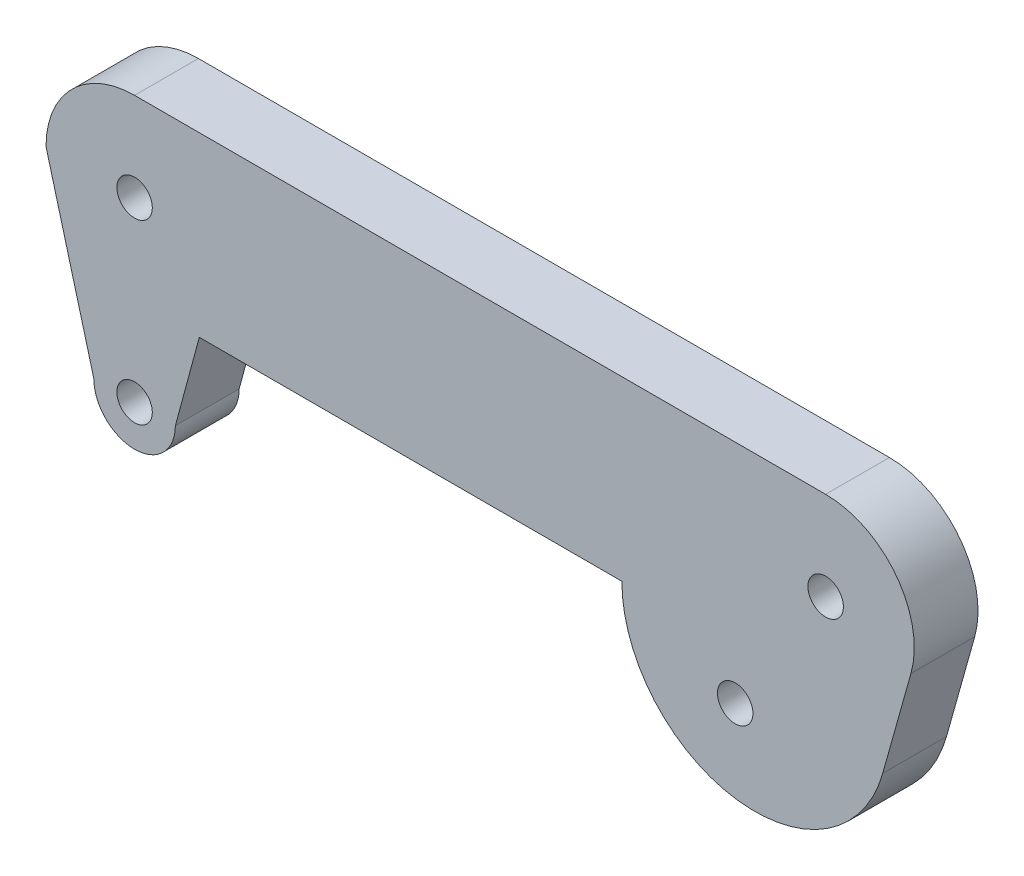
ISO-10303-21;
HEADER;
FILE_DESCRIPTION(('STEP AP214'),'2;1');
FILE_NAME('part.step','',(''),(''),'','','');
FILE_SCHEMA(('AUTOMOTIVE_DESIGN { 1 0 10303 214 1 1 1 1 }'));
ENDSEC;
DATA;
#1=APPLICATION_CONTEXT('core data for automotive mechanical design processes');
#2=APPLICATION_PROTOCOL_DEFINITION('international standard','automotive_design',2000,#1);
#3=PRODUCT_CONTEXT('',#1,'mechanical');
#4=PRODUCT('Part','Part','',(#3));
#5=PRODUCT_RELATED_PRODUCT_CATEGORY('part','',(#4));
#6=PRODUCT_DEFINITION_FORMATION('','',#4);
#7=PRODUCT_DEFINITION_CONTEXT('part definition',#1,'design');
#8=PRODUCT_DEFINITION('design','',#6,#7);
#9=PRODUCT_DEFINITION_SHAPE('','',#8);
#10=(LENGTH_UNIT() NAMED_UNIT(*) SI_UNIT(.MILLI.,.METRE.));
#11=(NAMED_UNIT(*) PLANE_ANGLE_UNIT() SI_UNIT($,.RADIAN.));
#12=(NAMED_UNIT(*) SI_UNIT($,.STERADIAN.) SOLID_ANGLE_UNIT());
#13=UNCERTAINTY_MEASURE_WITH_UNIT(LENGTH_MEASURE(1.E-05),#10,'distance_accuracy_value','');
#14=(GEOMETRIC_REPRESENTATION_CONTEXT(3) GLOBAL_UNCERTAINTY_ASSIGNED_CONTEXT((#13)) GLOBAL_UNIT_ASSIGNED_CONTEXT((#10,
#11,#12)) REPRESENTATION_CONTEXT('',''));
#15=CARTESIAN_POINT('',(0.,0.,0.));
#16=DIRECTION('',(0.,0.,1.));
#17=DIRECTION('',(1.,0.,0.));
#18=AXIS2_PLACEMENT_3D('',#15,#16,#17);
#19=CARTESIAN_POINT('',(0.,0.,3.6));
#20=DIRECTION('',(0.,0.,1.));
#21=DIRECTION('',(1.,0.,0.));
#22=AXIS2_PLACEMENT_3D('',#19,#20,#21);
#23=PLANE('',#22);
#24=CARTESIAN_POINT('',(39.,0.,3.6));
#25=DIRECTION('',(0.,0.,1.));
#26=DIRECTION('',(1.,0.,0.));
#27=AXIS2_PLACEMENT_3D('',#24,#25,#26);
#28=CIRCLE('',#27,0.999999999999998);
#29=CARTESIAN_POINT('',(40.,0.,3.6));
#30=VERTEX_POINT('',#29);
#31=EDGE_CURVE('E203',#30,#30,#28,.T.);
#32=ORIENTED_EDGE('',*,*,#31,.F.);
#33=EDGE_LOOP('',(#32));
#34=FACE_BOUND('',#33,.T.);
#35=CARTESIAN_POINT('',(0.,-10.,3.6));
#36=DIRECTION('',(0.,0.,1.));
#37=DIRECTION('',(1.,0.,0.));
#38=AXIS2_PLACEMENT_3D('',#35,#36,#37);
#39=CIRCLE('',#38,1.);
#40=CARTESIAN_POINT('',(1.00000000000005,-10.,3.6));
#41=VERTEX_POINT('',#40);
#42=EDGE_CURVE('E139',#41,#41,#39,.T.);
#43=ORIENTED_EDGE('',*,*,#42,.F.);
#44=EDGE_LOOP('',(#43));
#45=FACE_BOUND('',#44,.T.);
#46=CARTESIAN_POINT('',(0.,0.,3.6));
#47=DIRECTION('',(0.,0.,1.));
#48=DIRECTION('',(1.,0.,0.));
#49=AXIS2_PLACEMENT_3D('',#46,#47,#48);
#50=CIRCLE('',#49,5.);
#51=CARTESIAN_POINT('',(0.,5.,3.6));
#52=VERTEX_POINT('',#51);
#53=CARTESIAN_POINT('',(-4.99999990617374,-0.000968639534541923,3.6));
#54=VERTEX_POINT('',#53);
#55=EDGE_CURVE('E152',#52,#54,#50,.T.);
#56=ORIENTED_EDGE('',*,*,#55,.T.);
#57=DIRECTION('',(0.26068937942533,-0.965422729924481,0.));
#58=VECTOR('',#57,1.);
#59=CARTESIAN_POINT('',(-4.99999990617374,-0.000968639534541923,3.6));
#60=LINE('',#59,#58);
#61=CARTESIAN_POINT('',(-2.29999999999995,-10.,3.6));
#62=VERTEX_POINT('',#61);
#63=EDGE_CURVE('E95',#54,#62,#60,.T.);
#64=ORIENTED_EDGE('',*,*,#63,.T.);
#65=CARTESIAN_POINT('',(0.,-10.,3.6));
#66=DIRECTION('',(0.,0.,1.));
#67=DIRECTION('',(1.,0.,0.));
#68=AXIS2_PLACEMENT_3D('',#65,#66,#67);
#69=CIRCLE('',#68,2.3);
#70=CARTESIAN_POINT('',(2.30000000000005,-10.,3.6));
#71=VERTEX_POINT('',#70);
#72=EDGE_CURVE('E170',#62,#71,#69,.T.);
#73=ORIENTED_EDGE('',*,*,#72,.T.);
#74=DIRECTION('',(0.260979971046942,0.965344215662132,0.));
#75=VECTOR('',#74,1.);
#76=CARTESIAN_POINT('',(2.30000000000005,-10.,3.6));
#77=LINE('',#76,#75);
#78=CARTESIAN_POINT('',(3.65174566135431,-5.,3.6));
#79=VERTEX_POINT('',#78);
#80=EDGE_CURVE('E187',#71,#79,#77,.T.);
#81=ORIENTED_EDGE('',*,*,#80,.T.);
#82=DIRECTION('',(1.,0.,0.));
#83=VECTOR('',#82,1.);
#84=CARTESIAN_POINT('',(3.65174566135431,-5.,3.6));
#85=LINE('',#84,#83);
#86=CARTESIAN_POINT('',(27.5,-5.,3.6));
#87=VERTEX_POINT('',#86);
#88=EDGE_CURVE('E186',#79,#87,#85,.T.);
#89=ORIENTED_EDGE('',*,*,#88,.T.);
#90=CARTESIAN_POINT('',(35.,-5.,3.6));
#91=DIRECTION('',(0.,0.,1.));
#92=DIRECTION('',(-1.,0.,0.));
#93=AXIS2_PLACEMENT_3D('',#90,#91,#92);
#94=CIRCLE('',#93,7.5);
#95=CARTESIAN_POINT('',(42.2209570682401,-7.02676565459204,3.6));
#96=VERTEX_POINT('',#95);
#97=EDGE_CURVE('E117',#87,#96,#94,.T.);
#98=ORIENTED_EDGE('',*,*,#97,.T.);
#99=DIRECTION('',(0.270235420612273,0.962794275765341,0.));
#100=VECTOR('',#99,1.);
#101=CARTESIAN_POINT('',(43.8139713788267,-1.35117710306136,3.6));
#102=LINE('',#101,#100);
#103=CARTESIAN_POINT('',(43.8139713788267,-1.35117710306136,3.6));
#104=VERTEX_POINT('',#103);
#105=EDGE_CURVE('E111',#96,#104,#102,.T.);
#106=ORIENTED_EDGE('',*,*,#105,.T.);
#107=CARTESIAN_POINT('',(39.,0.,3.6));
#108=DIRECTION('',(0.,0.,1.));
#109=DIRECTION('',(1.,0.,0.));
#110=AXIS2_PLACEMENT_3D('',#107,#108,#109);
#111=CIRCLE('',#110,5.);
#112=CARTESIAN_POINT('',(39.,5.,3.6));
#113=VERTEX_POINT('',#112);
#114=EDGE_CURVE('E115',#104,#113,#111,.T.);
#115=ORIENTED_EDGE('',*,*,#114,.T.);
#116=DIRECTION('',(-1.,0.,0.));
#117=VECTOR('',#116,1.);
#118=CARTESIAN_POINT('',(0.,5.,3.6));
#119=LINE('',#118,#117);
#120=EDGE_CURVE('E49',#113,#52,#119,.T.);
#121=ORIENTED_EDGE('',*,*,#120,.T.);
#122=EDGE_LOOP('',(#56,#64,#73,#81,#89,#98,#106,#115,#121));
#123=FACE_BOUND('',#122,.T.);
#124=CARTESIAN_POINT('',(0.,0.,3.6));
#125=DIRECTION('',(0.,0.,1.));
#126=DIRECTION('',(1.,0.,0.));
#127=AXIS2_PLACEMENT_3D('',#124,#125,#126);
#128=CIRCLE('',#127,1.);
#129=CARTESIAN_POINT('',(1.,0.,3.6));
#130=VERTEX_POINT('',#129);
#131=EDGE_CURVE('E197',#130,#130,#128,.T.);
#132=ORIENTED_EDGE('',*,*,#131,.F.);
#133=EDGE_LOOP('',(#132));
#134=FACE_BOUND('',#133,.T.);
#135=CARTESIAN_POINT('',(33.8952959001801,-7.76697686679029,3.6));
#136=DIRECTION('',(0.,0.,1.));
#137=DIRECTION('',(1.,0.,0.));
#138=AXIS2_PLACEMENT_3D('',#135,#136,#137);
#139=CIRCLE('',#138,0.999999999999998);
#140=CARTESIAN_POINT('',(34.8952959001801,-7.76697686679029,3.6));
#141=VERTEX_POINT('',#140);
#142=EDGE_CURVE('E209',#141,#141,#139,.T.);
#143=ORIENTED_EDGE('',*,*,#142,.F.);
#144=EDGE_LOOP('',(#143));
#145=FACE_BOUND('',#144,.T.);
#146=ADVANCED_FACE('F32',(#34,#45,#123,#134,#145),#23,.T.);
#147=CARTESIAN_POINT('',(0.,0.,0.));
#148=DIRECTION('',(0.,0.,1.));
#149=DIRECTION('',(1.,0.,0.));
#150=AXIS2_PLACEMENT_3D('',#147,#148,#149);
#151=PLANE('',#150);
#152=CARTESIAN_POINT('',(0.,0.,0.));
#153=DIRECTION('',(0.,0.,1.));
#154=DIRECTION('',(1.,0.,0.));
#155=AXIS2_PLACEMENT_3D('',#152,#153,#154);
#156=CIRCLE('',#155,5.);
#157=CARTESIAN_POINT('',(0.,5.,0.));
#158=VERTEX_POINT('',#157);
#159=CARTESIAN_POINT('',(-4.99999990617374,-0.000968639534541923,0.));
#160=VERTEX_POINT('',#159);
#161=EDGE_CURVE('E135',#158,#160,#156,.T.);
#162=ORIENTED_EDGE('',*,*,#161,.F.);
#163=DIRECTION('',(-1.,0.,0.));
#164=VECTOR('',#163,1.);
#165=CARTESIAN_POINT('',(0.,5.,0.));
#166=LINE('',#165,#164);
#167=CARTESIAN_POINT('',(39.,5.,0.));
#168=VERTEX_POINT('',#167);
#169=EDGE_CURVE('E87',#168,#158,#166,.T.);
#170=ORIENTED_EDGE('',*,*,#169,.F.);
#171=CARTESIAN_POINT('',(39.,0.,0.));
#172=DIRECTION('',(0.,0.,1.));
#173=DIRECTION('',(1.,0.,0.));
#174=AXIS2_PLACEMENT_3D('',#171,#172,#173);
#175=CIRCLE('',#174,5.);
#176=CARTESIAN_POINT('',(43.8139713788267,-1.35117710306136,0.));
#177=VERTEX_POINT('',#176);
#178=EDGE_CURVE('E81',#177,#168,#175,.T.);
#179=ORIENTED_EDGE('',*,*,#178,.F.);
#180=DIRECTION('',(0.270235420612273,0.962794275765341,0.));
#181=VECTOR('',#180,1.);
#182=CARTESIAN_POINT('',(43.8139713788267,-1.35117710306136,0.));
#183=LINE('',#182,#181);
#184=CARTESIAN_POINT('',(42.2209570682401,-7.02676565459204,0.));
#185=VERTEX_POINT('',#184);
#186=EDGE_CURVE('E125',#185,#177,#183,.T.);
#187=ORIENTED_EDGE('',*,*,#186,.F.);
#188=CARTESIAN_POINT('',(35.,-5.,0.));
#189=DIRECTION('',(0.,0.,1.));
#190=DIRECTION('',(-1.,0.,0.));
#191=AXIS2_PLACEMENT_3D('',#188,#189,#190);
#192=CIRCLE('',#191,7.5);
#193=CARTESIAN_POINT('',(27.5,-5.,0.));
#194=VERTEX_POINT('',#193);
#195=EDGE_CURVE('E147',#194,#185,#192,.T.);
#196=ORIENTED_EDGE('',*,*,#195,.F.);
#197=DIRECTION('',(1.,0.,0.));
#198=VECTOR('',#197,1.);
#199=CARTESIAN_POINT('',(3.65174566135431,-5.,0.));
#200=LINE('',#199,#198);
#201=CARTESIAN_POINT('',(3.65174566135431,-5.,0.));
#202=VERTEX_POINT('',#201);
#203=EDGE_CURVE('E145',#202,#194,#200,.T.);
#204=ORIENTED_EDGE('',*,*,#203,.F.);
#205=DIRECTION('',(0.260979971046942,0.965344215662132,0.));
#206=VECTOR('',#205,1.);
#207=CARTESIAN_POINT('',(2.30000000000005,-10.,0.));
#208=LINE('',#207,#206);
#209=CARTESIAN_POINT('',(2.30000000000005,-10.,0.));
#210=VERTEX_POINT('',#209);
#211=EDGE_CURVE('E143',#210,#202,#208,.T.);
#212=ORIENTED_EDGE('',*,*,#211,.F.);
#213=CARTESIAN_POINT('',(0.,-10.,0.));
#214=DIRECTION('',(0.,0.,1.));
#215=DIRECTION('',(1.,0.,0.));
#216=AXIS2_PLACEMENT_3D('',#213,#214,#215);
#217=CIRCLE('',#216,2.3);
#218=CARTESIAN_POINT('',(-2.29999999999995,-10.,0.));
#219=VERTEX_POINT('',#218);
#220=EDGE_CURVE('E141',#219,#210,#217,.T.);
#221=ORIENTED_EDGE('',*,*,#220,.F.);
#222=DIRECTION('',(0.26068937942533,-0.965422729924481,0.));
#223=VECTOR('',#222,1.);
#224=CARTESIAN_POINT('',(-4.99999990617374,-0.000968639534541923,0.));
#225=LINE('',#224,#223);
#226=EDGE_CURVE('E138',#160,#219,#225,.T.);
#227=ORIENTED_EDGE('',*,*,#226,.F.);
#228=EDGE_LOOP('',(#162,#170,#179,#187,#196,#204,#212,#221,#227));
#229=FACE_BOUND('',#228,.T.);
#230=CARTESIAN_POINT('',(0.,-10.,0.));
#231=DIRECTION('',(0.,0.,1.));
#232=DIRECTION('',(1.,0.,0.));
#233=AXIS2_PLACEMENT_3D('',#230,#231,#232);
#234=CIRCLE('',#233,1.);
#235=CARTESIAN_POINT('',(1.00000000000005,-10.,0.));
#236=VERTEX_POINT('',#235);
#237=EDGE_CURVE('E194',#236,#236,#234,.T.);
#238=ORIENTED_EDGE('',*,*,#237,.T.);
#239=EDGE_LOOP('',(#238));
#240=FACE_BOUND('',#239,.T.);
#241=CARTESIAN_POINT('',(0.,0.,0.));
#242=DIRECTION('',(0.,0.,1.));
#243=DIRECTION('',(1.,0.,0.));
#244=AXIS2_PLACEMENT_3D('',#241,#242,#243);
#245=CIRCLE('',#244,1.);
#246=CARTESIAN_POINT('',(1.,0.,0.));
#247=VERTEX_POINT('',#246);
#248=EDGE_CURVE('E200',#247,#247,#245,.T.);
#249=ORIENTED_EDGE('',*,*,#248,.T.);
#250=EDGE_LOOP('',(#249));
#251=FACE_BOUND('',#250,.T.);
#252=CARTESIAN_POINT('',(39.,0.,0.));
#253=DIRECTION('',(0.,0.,1.));
#254=DIRECTION('',(1.,0.,0.));
#255=AXIS2_PLACEMENT_3D('',#252,#253,#254);
#256=CIRCLE('',#255,0.999999999999998);
#257=CARTESIAN_POINT('',(40.,0.,0.));
#258=VERTEX_POINT('',#257);
#259=EDGE_CURVE('E206',#258,#258,#256,.T.);
#260=ORIENTED_EDGE('',*,*,#259,.T.);
#261=EDGE_LOOP('',(#260));
#262=FACE_BOUND('',#261,.T.);
#263=CARTESIAN_POINT('',(33.8952959001801,-7.76697686679029,0.));
#264=DIRECTION('',(0.,0.,1.));
#265=DIRECTION('',(1.,0.,0.));
#266=AXIS2_PLACEMENT_3D('',#263,#264,#265);
#267=CIRCLE('',#266,0.999999999999998);
#268=CARTESIAN_POINT('',(34.8952959001801,-7.76697686679029,0.));
#269=VERTEX_POINT('',#268);
#270=EDGE_CURVE('E212',#269,#269,#267,.T.);
#271=ORIENTED_EDGE('',*,*,#270,.T.);
#272=EDGE_LOOP('',(#271));
#273=FACE_BOUND('',#272,.T.);
#274=ADVANCED_FACE('F174',(#229,#240,#251,#262,#273),#151,.F.);
#275=CARTESIAN_POINT('',(0.,0.,3.6));
#276=DIRECTION('',(0.,0.,-1.));
#277=DIRECTION('',(-1.,0.,0.));
#278=AXIS2_PLACEMENT_3D('',#275,#276,#277);
#279=CYLINDRICAL_SURFACE('',#278,5.);
#280=ORIENTED_EDGE('',*,*,#161,.T.);
#281=DIRECTION('',(0.,0.,-1.));
#282=VECTOR('',#281,1.);
#283=CARTESIAN_POINT('',(-4.99999990617374,-0.000968639534541923,3.6));
#284=LINE('',#283,#282);
#285=EDGE_CURVE('E11',#54,#160,#284,.T.);
#286=ORIENTED_EDGE('',*,*,#285,.F.);
#287=ORIENTED_EDGE('',*,*,#55,.F.);
#288=DIRECTION('',(0.,0.,-1.));
#289=VECTOR('',#288,1.);
#290=CARTESIAN_POINT('',(0.,5.,3.6));
#291=LINE('',#290,#289);
#292=EDGE_CURVE('E131',#52,#158,#291,.T.);
#293=ORIENTED_EDGE('',*,*,#292,.T.);
#294=EDGE_LOOP('',(#280,#286,#287,#293));
#295=FACE_BOUND('',#294,.T.);
#296=ADVANCED_FACE('F34',(#295),#279,.T.);
#297=CARTESIAN_POINT('',(-4.99999990617374,-0.000968639534541923,3.6));
#298=DIRECTION('',(0.965422729924481,0.26068937942533,0.));
#299=DIRECTION('',(-0.26068937942533,0.965422729924481,0.));
#300=AXIS2_PLACEMENT_3D('',#297,#298,#299);
#301=PLANE('',#300);
#302=ORIENTED_EDGE('',*,*,#226,.T.);
#303=DIRECTION('',(0.,0.,-1.));
#304=VECTOR('',#303,1.);
#305=CARTESIAN_POINT('',(-2.29999999999995,-10.,3.6));
#306=LINE('',#305,#304);
#307=EDGE_CURVE('E41',#62,#219,#306,.T.);
#308=ORIENTED_EDGE('',*,*,#307,.F.);
#309=ORIENTED_EDGE('',*,*,#63,.F.);
#310=ORIENTED_EDGE('',*,*,#285,.T.);
#311=EDGE_LOOP('',(#302,#308,#309,#310));
#312=FACE_BOUND('',#311,.T.);
#313=ADVANCED_FACE('F250',(#312),#301,.F.);
#314=CARTESIAN_POINT('',(0.,-10.,3.6));
#315=DIRECTION('',(0.,0.,-1.));
#316=DIRECTION('',(-1.,0.,0.));
#317=AXIS2_PLACEMENT_3D('',#314,#315,#316);
#318=CYLINDRICAL_SURFACE('',#317,2.3);
#319=ORIENTED_EDGE('',*,*,#220,.T.);
#320=DIRECTION('',(0.,0.,-1.));
#321=VECTOR('',#320,1.);
#322=CARTESIAN_POINT('',(2.30000000000005,-10.,3.6));
#323=LINE('',#322,#321);
#324=EDGE_CURVE('E162',#71,#210,#323,.T.);
#325=ORIENTED_EDGE('',*,*,#324,.F.);
#326=ORIENTED_EDGE('',*,*,#72,.F.);
#327=ORIENTED_EDGE('',*,*,#307,.T.);
#328=EDGE_LOOP('',(#319,#325,#326,#327));
#329=FACE_BOUND('',#328,.T.);
#330=ADVANCED_FACE('F168',(#329),#318,.T.);
#331=CARTESIAN_POINT('',(2.30000000000005,-10.,3.6));
#332=DIRECTION('',(-0.965344215662132,0.260979971046942,0.));
#333=DIRECTION('',(-0.260979971046942,-0.965344215662132,0.));
#334=AXIS2_PLACEMENT_3D('',#331,#332,#333);
#335=PLANE('',#334);
#336=ORIENTED_EDGE('',*,*,#211,.T.);
#337=DIRECTION('',(0.,0.,-1.));
#338=VECTOR('',#337,1.);
#339=CARTESIAN_POINT('',(3.65174566135431,-5.,3.6));
#340=LINE('',#339,#338);
#341=EDGE_CURVE('E159',#79,#202,#340,.T.);
#342=ORIENTED_EDGE('',*,*,#341,.F.);
#343=ORIENTED_EDGE('',*,*,#80,.F.);
#344=ORIENTED_EDGE('',*,*,#324,.T.);
#345=EDGE_LOOP('',(#336,#342,#343,#344));
#346=FACE_BOUND('',#345,.T.);
#347=ADVANCED_FACE('F180',(#346),#335,.F.);
#348=CARTESIAN_POINT('',(3.65174566135431,-5.,3.6));
#349=DIRECTION('',(0.,1.,0.));
#350=DIRECTION('',(-1.,0.,0.));
#351=AXIS2_PLACEMENT_3D('',#348,#349,#350);
#352=PLANE('',#351);
#353=ORIENTED_EDGE('',*,*,#203,.T.);
#354=DIRECTION('',(0.,0.,-1.));
#355=VECTOR('',#354,1.);
#356=CARTESIAN_POINT('',(27.5,-5.,3.6));
#357=LINE('',#356,#355);
#358=EDGE_CURVE('E156',#87,#194,#357,.T.);
#359=ORIENTED_EDGE('',*,*,#358,.F.);
#360=ORIENTED_EDGE('',*,*,#88,.F.);
#361=ORIENTED_EDGE('',*,*,#341,.T.);
#362=EDGE_LOOP('',(#353,#359,#360,#361));
#363=FACE_BOUND('',#362,.T.);
#364=ADVANCED_FACE('F184',(#363),#352,.F.);
#365=CARTESIAN_POINT('',(35.,-5.,3.6));
#366=DIRECTION('',(0.,0.,-1.));
#367=DIRECTION('',(-1.,0.,0.));
#368=AXIS2_PLACEMENT_3D('',#365,#366,#367);
#369=CYLINDRICAL_SURFACE('',#368,7.5);
#370=ORIENTED_EDGE('',*,*,#195,.T.);
#371=DIRECTION('',(0.,0.,-1.));
#372=VECTOR('',#371,1.);
#373=CARTESIAN_POINT('',(42.2209570682401,-7.02676565459204,3.6));
#374=LINE('',#373,#372);
#375=EDGE_CURVE('E126',#96,#185,#374,.T.);
#376=ORIENTED_EDGE('',*,*,#375,.F.);
#377=ORIENTED_EDGE('',*,*,#97,.F.);
#378=ORIENTED_EDGE('',*,*,#358,.T.);
#379=EDGE_LOOP('',(#370,#376,#377,#378));
#380=FACE_BOUND('',#379,.T.);
#381=ADVANCED_FACE('F241',(#380),#369,.T.);
#382=CARTESIAN_POINT('',(43.8139713788267,-1.35117710306136,3.6));
#383=DIRECTION('',(-0.962794275765341,0.270235420612273,0.));
#384=DIRECTION('',(-0.270235420612273,-0.962794275765341,0.));
#385=AXIS2_PLACEMENT_3D('',#382,#383,#384);
#386=PLANE('',#385);
#387=ORIENTED_EDGE('',*,*,#186,.T.);
#388=DIRECTION('',(0.,0.,-1.));
#389=VECTOR('',#388,1.);
#390=CARTESIAN_POINT('',(43.8139713788267,-1.35117710306136,3.6));
#391=LINE('',#390,#389);
#392=EDGE_CURVE('E122',#104,#177,#391,.T.);
#393=ORIENTED_EDGE('',*,*,#392,.F.);
#394=ORIENTED_EDGE('',*,*,#105,.F.);
#395=ORIENTED_EDGE('',*,*,#375,.T.);
#396=EDGE_LOOP('',(#387,#393,#394,#395));
#397=FACE_BOUND('',#396,.T.);
#398=ADVANCED_FACE('F123',(#397),#386,.F.);
#399=CARTESIAN_POINT('',(39.,0.,3.6));
#400=DIRECTION('',(0.,0.,-1.));
#401=DIRECTION('',(-1.,0.,0.));
#402=AXIS2_PLACEMENT_3D('',#399,#400,#401);
#403=CYLINDRICAL_SURFACE('',#402,5.);
#404=ORIENTED_EDGE('',*,*,#178,.T.);
#405=DIRECTION('',(0.,0.,-1.));
#406=VECTOR('',#405,1.);
#407=CARTESIAN_POINT('',(39.,5.,3.6));
#408=LINE('',#407,#406);
#409=EDGE_CURVE('E127',#113,#168,#408,.T.);
#410=ORIENTED_EDGE('',*,*,#409,.F.);
#411=ORIENTED_EDGE('',*,*,#114,.F.);
#412=ORIENTED_EDGE('',*,*,#392,.T.);
#413=EDGE_LOOP('',(#404,#410,#411,#412));
#414=FACE_BOUND('',#413,.T.);
#415=ADVANCED_FACE('F129',(#414),#403,.T.);
#416=CARTESIAN_POINT('',(0.,5.,3.6));
#417=DIRECTION('',(0.,-1.,0.));
#418=DIRECTION('',(0.,0.,-1.));
#419=AXIS2_PLACEMENT_3D('',#416,#417,#418);
#420=PLANE('',#419);
#421=ORIENTED_EDGE('',*,*,#169,.T.);
#422=ORIENTED_EDGE('',*,*,#292,.F.);
#423=ORIENTED_EDGE('',*,*,#120,.F.);
#424=ORIENTED_EDGE('',*,*,#409,.T.);
#425=EDGE_LOOP('',(#421,#422,#423,#424));
#426=FACE_BOUND('',#425,.T.);
#427=ADVANCED_FACE('F234',(#426),#420,.F.);
#428=CARTESIAN_POINT('',(0.,-10.,3.6));
#429=DIRECTION('',(0.,0.,-1.));
#430=DIRECTION('',(-1.,0.,0.));
#431=AXIS2_PLACEMENT_3D('',#428,#429,#430);
#432=CYLINDRICAL_SURFACE('',#431,1.);
#433=ORIENTED_EDGE('',*,*,#42,.T.);
#434=EDGE_LOOP('',(#433));
#435=FACE_BOUND('',#434,.T.);
#436=ORIENTED_EDGE('',*,*,#237,.F.);
#437=EDGE_LOOP('',(#436));
#438=FACE_BOUND('',#437,.T.);
#439=ADVANCED_FACE('F231',(#435,#438),#432,.F.);
#440=CARTESIAN_POINT('',(0.,0.,3.6));
#441=DIRECTION('',(0.,0.,-1.));
#442=DIRECTION('',(-1.,0.,0.));
#443=AXIS2_PLACEMENT_3D('',#440,#441,#442);
#444=CYLINDRICAL_SURFACE('',#443,1.);
#445=ORIENTED_EDGE('',*,*,#131,.T.);
#446=EDGE_LOOP('',(#445));
#447=FACE_BOUND('',#446,.T.);
#448=ORIENTED_EDGE('',*,*,#248,.F.);
#449=EDGE_LOOP('',(#448));
#450=FACE_BOUND('',#449,.T.);
#451=ADVANCED_FACE('F319',(#447,#450),#444,.F.);
#452=CARTESIAN_POINT('',(39.,0.,3.6));
#453=DIRECTION('',(0.,0.,-1.));
#454=DIRECTION('',(-1.,0.,0.));
#455=AXIS2_PLACEMENT_3D('',#452,#453,#454);
#456=CYLINDRICAL_SURFACE('',#455,0.999999999999998);
#457=ORIENTED_EDGE('',*,*,#31,.T.);
#458=EDGE_LOOP('',(#457));
#459=FACE_BOUND('',#458,.T.);
#460=ORIENTED_EDGE('',*,*,#259,.F.);
#461=EDGE_LOOP('',(#460));
#462=FACE_BOUND('',#461,.T.);
#463=ADVANCED_FACE('F327',(#459,#462),#456,.F.);
#464=CARTESIAN_POINT('',(33.8952959001801,-7.76697686679029,3.6));
#465=DIRECTION('',(0.,0.,-1.));
#466=DIRECTION('',(-1.,0.,0.));
#467=AXIS2_PLACEMENT_3D('',#464,#465,#466);
#468=CYLINDRICAL_SURFACE('',#467,0.999999999999998);
#469=ORIENTED_EDGE('',*,*,#142,.T.);
#470=EDGE_LOOP('',(#469));
#471=FACE_BOUND('',#470,.T.);
#472=ORIENTED_EDGE('',*,*,#270,.F.);
#473=EDGE_LOOP('',(#472));
#474=FACE_BOUND('',#473,.T.);
#475=ADVANCED_FACE('F218',(#471,#474),#468,.F.);
#476=CLOSED_SHELL('',(#146,#274,#296,#313,#330,#347,#364,#381,#398,#415,#427,#439,#451,#463,#475));
#477=MANIFOLD_SOLID_BREP('B2',#476);
#478=ADVANCED_BREP_SHAPE_REPRESENTATION('',(#18,#477),#14);
#479=SHAPE_DEFINITION_REPRESENTATION(#9,#478);
ENDSEC;
END-ISO-10303-21;
